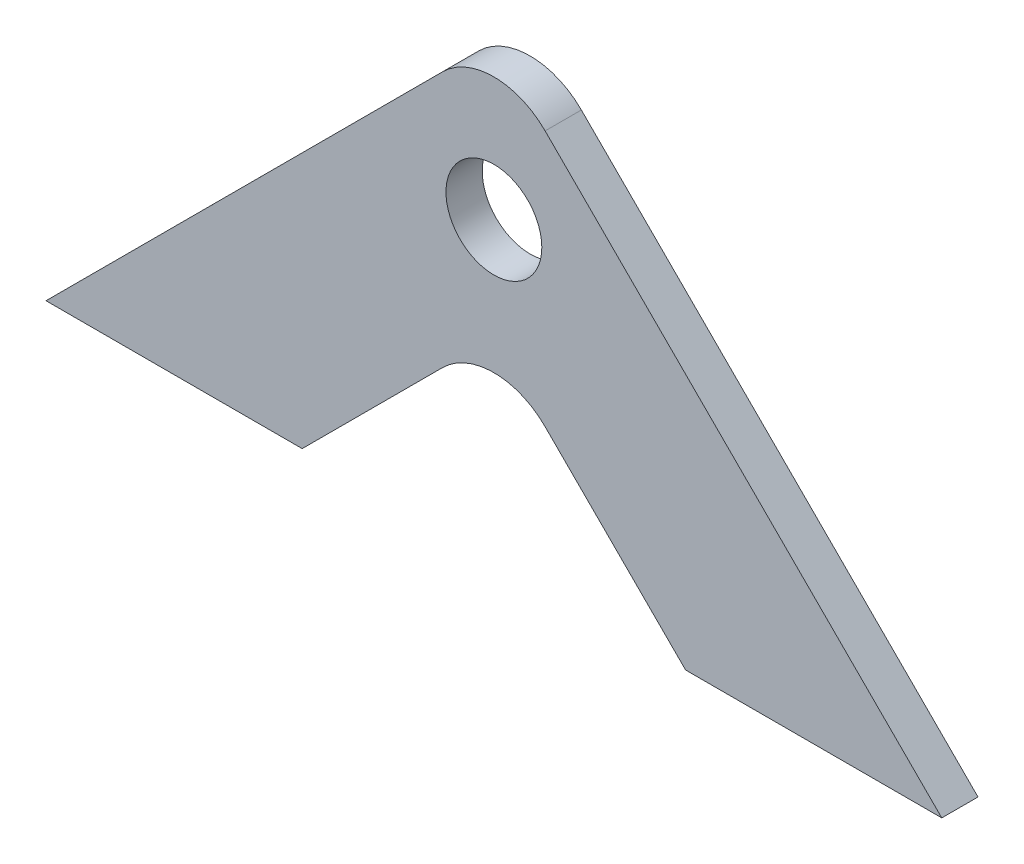
ISO-10303-21;
HEADER;
FILE_DESCRIPTION(('STEP AP214'),'2;1');
FILE_NAME('part.step','',(''),(''),'','','');
FILE_SCHEMA(('AUTOMOTIVE_DESIGN { 1 0 10303 214 1 1 1 1 }'));
ENDSEC;
DATA;
#1=APPLICATION_CONTEXT('core data for automotive mechanical design processes');
#2=APPLICATION_PROTOCOL_DEFINITION('international standard','automotive_design',2000,#1);
#3=PRODUCT_CONTEXT('',#1,'mechanical');
#4=PRODUCT('Part','Part','',(#3));
#5=PRODUCT_RELATED_PRODUCT_CATEGORY('part','',(#4));
#6=PRODUCT_DEFINITION_FORMATION('','',#4);
#7=PRODUCT_DEFINITION_CONTEXT('part definition',#1,'design');
#8=PRODUCT_DEFINITION('design','',#6,#7);
#9=PRODUCT_DEFINITION_SHAPE('','',#8);
#10=(LENGTH_UNIT() NAMED_UNIT(*) SI_UNIT(.MILLI.,.METRE.));
#11=(NAMED_UNIT(*) PLANE_ANGLE_UNIT() SI_UNIT($,.RADIAN.));
#12=(NAMED_UNIT(*) SI_UNIT($,.STERADIAN.) SOLID_ANGLE_UNIT());
#13=UNCERTAINTY_MEASURE_WITH_UNIT(LENGTH_MEASURE(1.E-05),#10,'distance_accuracy_value','');
#14=(GEOMETRIC_REPRESENTATION_CONTEXT(3) GLOBAL_UNCERTAINTY_ASSIGNED_CONTEXT((#13)) GLOBAL_UNIT_ASSIGNED_CONTEXT((#10,
#11,#12)) REPRESENTATION_CONTEXT('',''));
#15=CARTESIAN_POINT('',(0.,0.,0.));
#16=DIRECTION('',(0.,0.,1.));
#17=DIRECTION('',(1.,0.,0.));
#18=AXIS2_PLACEMENT_3D('',#15,#16,#17);
#19=CARTESIAN_POINT('',(44.8343967267449,44.8352566752149,-3.175));
#20=DIRECTION('',(0.707099999869934,0.707113562438128,0.));
#21=DIRECTION('',(-0.707113562438128,0.707099999869934,0.));
#22=AXIS2_PLACEMENT_3D('',#19,#20,#21);
#23=PLANE('',#22);
#24=DIRECTION('',(0.707113562438128,-0.707099999869934,0.));
#25=VECTOR('',#24,1.);
#26=CARTESIAN_POINT('',(44.8343967267449,44.8352566752149,0.));
#27=LINE('',#26,#25);
#28=CARTESIAN_POINT('',(42.5900849991741,47.079525356474,0.));
#29=VERTEX_POINT('',#28);
#30=CARTESIAN_POINT('',(77.3512770817062,12.319,0.));
#31=VERTEX_POINT('',#30);
#32=EDGE_CURVE('E143',#29,#31,#27,.T.);
#33=ORIENTED_EDGE('',*,*,#32,.T.);
#34=DIRECTION('',(0.,0.,1.));
#35=VECTOR('',#34,1.);
#36=CARTESIAN_POINT('',(77.3512770817062,12.319,-3.175));
#37=LINE('',#36,#35);
#38=CARTESIAN_POINT('',(77.3512770817062,12.319,-3.175));
#39=VERTEX_POINT('',#38);
#40=EDGE_CURVE('E160',#39,#31,#37,.T.);
#41=ORIENTED_EDGE('',*,*,#40,.F.);
#42=DIRECTION('',(0.707113562438128,-0.707099999869934,0.));
#43=VECTOR('',#42,1.);
#44=CARTESIAN_POINT('',(44.8343967267449,44.8352566752149,-3.175));
#45=LINE('',#44,#43);
#46=CARTESIAN_POINT('',(42.5900849991741,47.079525356474,-3.175));
#47=VERTEX_POINT('',#46);
#48=EDGE_CURVE('E180',#47,#39,#45,.T.);
#49=ORIENTED_EDGE('',*,*,#48,.F.);
#50=DIRECTION('',(0.,0.,1.));
#51=VECTOR('',#50,1.);
#52=CARTESIAN_POINT('',(42.5900849991741,47.079525356474,-3.175));
#53=LINE('',#52,#51);
#54=EDGE_CURVE('E11',#47,#29,#53,.T.);
#55=ORIENTED_EDGE('',*,*,#54,.T.);
#56=EDGE_LOOP('',(#33,#41,#49,#55));
#57=FACE_BOUND('',#56,.T.);
#58=ADVANCED_FACE('F45',(#57),#23,.T.);
#59=CARTESIAN_POINT('',(38.1,42.5893542349919,-3.175));
#60=DIRECTION('',(0.,0.,1.));
#61=DIRECTION('',(-1.,0.,0.));
#62=AXIS2_PLACEMENT_3D('',#59,#60,#61);
#63=CYLINDRICAL_SURFACE('',#62,6.35);
#64=CARTESIAN_POINT('',(38.1,42.5893542349919,0.));
#65=DIRECTION('',(0.,0.,1.));
#66=DIRECTION('',(1.,0.,0.));
#67=AXIS2_PLACEMENT_3D('',#64,#65,#66);
#68=CIRCLE('',#67,6.35);
#69=CARTESIAN_POINT('',(33.6099150008259,47.079525356474,0.));
#70=VERTEX_POINT('',#69);
#71=EDGE_CURVE('E146',#29,#70,#68,.T.);
#72=ORIENTED_EDGE('',*,*,#71,.F.);
#73=ORIENTED_EDGE('',*,*,#54,.F.);
#74=CARTESIAN_POINT('',(38.1,42.5893542349919,-3.175));
#75=DIRECTION('',(0.,0.,1.));
#76=DIRECTION('',(1.,0.,0.));
#77=AXIS2_PLACEMENT_3D('',#74,#75,#76);
#78=CIRCLE('',#77,6.35);
#79=CARTESIAN_POINT('',(33.6099150008259,47.079525356474,-3.175));
#80=VERTEX_POINT('',#79);
#81=EDGE_CURVE('E100',#47,#80,#78,.T.);
#82=ORIENTED_EDGE('',*,*,#81,.T.);
#83=DIRECTION('',(0.,0.,1.));
#84=VECTOR('',#83,1.);
#85=CARTESIAN_POINT('',(33.6099150008259,47.079525356474,-3.175));
#86=LINE('',#85,#84);
#87=EDGE_CURVE('E54',#80,#70,#86,.T.);
#88=ORIENTED_EDGE('',*,*,#87,.T.);
#89=EDGE_LOOP('',(#72,#73,#82,#88));
#90=FACE_BOUND('',#89,.T.);
#91=ADVANCED_FACE('F172',(#90),#63,.T.);
#92=CARTESIAN_POINT('',(-6.73512749876113,6.73525668222317,-3.175));
#93=DIRECTION('',(-0.707099999869934,0.707113562438127,0.));
#94=DIRECTION('',(-0.707113562438127,-0.707099999869934,0.));
#95=AXIS2_PLACEMENT_3D('',#92,#93,#94);
#96=PLANE('',#95);
#97=DIRECTION('',(0.707113562438127,0.707099999869934,0.));
#98=VECTOR('',#97,1.);
#99=CARTESIAN_POINT('',(-6.73512749876113,6.73525668222317,0.));
#100=LINE('',#99,#98);
#101=CARTESIAN_POINT('',(-1.15127708170621,12.319,0.));
#102=VERTEX_POINT('',#101);
#103=EDGE_CURVE('E149',#102,#70,#100,.T.);
#104=ORIENTED_EDGE('',*,*,#103,.T.);
#105=ORIENTED_EDGE('',*,*,#87,.F.);
#106=DIRECTION('',(0.707113562438127,0.707099999869934,0.));
#107=VECTOR('',#106,1.);
#108=CARTESIAN_POINT('',(-6.73512749876113,6.73525668222317,-3.175));
#109=LINE('',#108,#107);
#110=CARTESIAN_POINT('',(-1.15127708170621,12.319,-3.175));
#111=VERTEX_POINT('',#110);
#112=EDGE_CURVE('E183',#111,#80,#109,.T.);
#113=ORIENTED_EDGE('',*,*,#112,.F.);
#114=DIRECTION('',(0.,0.,1.));
#115=VECTOR('',#114,1.);
#116=CARTESIAN_POINT('',(-1.15127708170621,12.319,-3.175));
#117=LINE('',#116,#115);
#118=EDGE_CURVE('E167',#111,#102,#117,.T.);
#119=ORIENTED_EDGE('',*,*,#118,.T.);
#120=EDGE_LOOP('',(#104,#105,#113,#119));
#121=FACE_BOUND('',#120,.T.);
#122=ADVANCED_FACE('F195',(#121),#96,.T.);
#123=CARTESIAN_POINT('',(0.,12.319,-3.175));
#124=DIRECTION('',(0.,1.,0.));
#125=DIRECTION('',(0.,0.,-1.));
#126=AXIS2_PLACEMENT_3D('',#123,#124,#125);
#127=PLANE('',#126);
#128=DIRECTION('',(1.,0.,0.));
#129=VECTOR('',#128,1.);
#130=CARTESIAN_POINT('',(0.,12.319,0.));
#131=LINE('',#130,#129);
#132=CARTESIAN_POINT('',(21.299578529834,12.319,0.));
#133=VERTEX_POINT('',#132);
#134=EDGE_CURVE('E151',#102,#133,#131,.T.);
#135=ORIENTED_EDGE('',*,*,#134,.F.);
#136=ORIENTED_EDGE('',*,*,#118,.F.);
#137=DIRECTION('',(1.,0.,0.));
#138=VECTOR('',#137,1.);
#139=CARTESIAN_POINT('',(0.,12.319,-3.175));
#140=LINE('',#139,#138);
#141=CARTESIAN_POINT('',(21.299578529834,12.319,-3.175));
#142=VERTEX_POINT('',#141);
#143=EDGE_CURVE('E136',#111,#142,#140,.T.);
#144=ORIENTED_EDGE('',*,*,#143,.T.);
#145=DIRECTION('',(0.,0.,1.));
#146=VECTOR('',#145,1.);
#147=CARTESIAN_POINT('',(21.299578529834,12.319,-3.175));
#148=LINE('',#147,#146);
#149=EDGE_CURVE('E164',#142,#133,#148,.T.);
#150=ORIENTED_EDGE('',*,*,#149,.T.);
#151=EDGE_LOOP('',(#135,#136,#144,#150));
#152=FACE_BOUND('',#151,.T.);
#153=ADVANCED_FACE('F191',(#152),#127,.F.);
#154=CARTESIAN_POINT('',(4.49008499917408,-4.49017112148211,-3.175));
#155=DIRECTION('',(-0.707099999869934,0.707113562438127,0.));
#156=DIRECTION('',(-0.707113562438128,-0.707099999869934,0.));
#157=AXIS2_PLACEMENT_3D('',#154,#155,#156);
#158=PLANE('',#157);
#159=DIRECTION('',(0.707113562438128,0.707099999869934,0.));
#160=VECTOR('',#159,1.);
#161=CARTESIAN_POINT('',(4.49008499917408,-4.49017112148211,0.));
#162=LINE('',#161,#160);
#163=CARTESIAN_POINT('',(33.6099150008259,24.629100356474,0.));
#164=VERTEX_POINT('',#163);
#165=EDGE_CURVE('E154',#133,#164,#162,.T.);
#166=ORIENTED_EDGE('',*,*,#165,.F.);
#167=ORIENTED_EDGE('',*,*,#149,.F.);
#168=DIRECTION('',(0.707113562438128,0.707099999869934,0.));
#169=VECTOR('',#168,1.);
#170=CARTESIAN_POINT('',(4.49008499917408,-4.49017112148211,-3.175));
#171=LINE('',#170,#169);
#172=CARTESIAN_POINT('',(33.6099150008259,24.629100356474,-3.175));
#173=VERTEX_POINT('',#172);
#174=EDGE_CURVE('E134',#142,#173,#171,.T.);
#175=ORIENTED_EDGE('',*,*,#174,.T.);
#176=DIRECTION('',(0.,0.,1.));
#177=VECTOR('',#176,1.);
#178=CARTESIAN_POINT('',(33.6099150008259,24.629100356474,-3.175));
#179=LINE('',#178,#177);
#180=EDGE_CURVE('E128',#173,#164,#179,.T.);
#181=ORIENTED_EDGE('',*,*,#180,.T.);
#182=EDGE_LOOP('',(#166,#167,#175,#181));
#183=FACE_BOUND('',#182,.T.);
#184=ADVANCED_FACE('F194',(#183),#158,.F.);
#185=CARTESIAN_POINT('',(38.1,20.1389292349919,-3.175));
#186=DIRECTION('',(0.,0.,1.));
#187=DIRECTION('',(-1.,0.,0.));
#188=AXIS2_PLACEMENT_3D('',#185,#186,#187);
#189=CYLINDRICAL_SURFACE('',#188,6.35);
#190=CARTESIAN_POINT('',(38.1,20.1389292349919,0.));
#191=DIRECTION('',(0.,0.,1.));
#192=DIRECTION('',(1.,0.,0.));
#193=AXIS2_PLACEMENT_3D('',#190,#191,#192);
#194=CIRCLE('',#193,6.35);
#195=CARTESIAN_POINT('',(42.5900849991741,24.629100356474,0.));
#196=VERTEX_POINT('',#195);
#197=EDGE_CURVE('E157',#164,#196,#194,.F.);
#198=ORIENTED_EDGE('',*,*,#197,.F.);
#199=ORIENTED_EDGE('',*,*,#180,.F.);
#200=CARTESIAN_POINT('',(38.1,20.1389292349919,-3.175));
#201=DIRECTION('',(0.,0.,1.));
#202=DIRECTION('',(1.,0.,0.));
#203=AXIS2_PLACEMENT_3D('',#200,#201,#202);
#204=CIRCLE('',#203,6.35);
#205=CARTESIAN_POINT('',(42.5900849991741,24.629100356474,-3.175));
#206=VERTEX_POINT('',#205);
#207=EDGE_CURVE('E118',#173,#206,#204,.F.);
#208=ORIENTED_EDGE('',*,*,#207,.T.);
#209=DIRECTION('',(0.,0.,1.));
#210=VECTOR('',#209,1.);
#211=CARTESIAN_POINT('',(42.5900849991741,24.629100356474,-3.175));
#212=LINE('',#211,#210);
#213=EDGE_CURVE('E123',#206,#196,#212,.T.);
#214=ORIENTED_EDGE('',*,*,#213,.T.);
#215=EDGE_LOOP('',(#198,#199,#208,#214));
#216=FACE_BOUND('',#215,.T.);
#217=ADVANCED_FACE('F131',(#216),#189,.F.);
#218=CARTESIAN_POINT('',(33.6091842288097,33.6098288715097,-3.175));
#219=DIRECTION('',(0.707099999869934,0.707113562438128,0.));
#220=DIRECTION('',(-0.707113562438128,0.707099999869934,0.));
#221=AXIS2_PLACEMENT_3D('',#218,#219,#220);
#222=PLANE('',#221);
#223=DIRECTION('',(0.707113562438128,-0.707099999869934,0.));
#224=VECTOR('',#223,1.);
#225=CARTESIAN_POINT('',(33.6091842288097,33.6098288715097,0.));
#226=LINE('',#225,#224);
#227=CARTESIAN_POINT('',(54.900421470166,12.319,0.));
#228=VERTEX_POINT('',#227);
#229=EDGE_CURVE('E125',#196,#228,#226,.T.);
#230=ORIENTED_EDGE('',*,*,#229,.F.);
#231=ORIENTED_EDGE('',*,*,#213,.F.);
#232=DIRECTION('',(0.707113562438128,-0.707099999869934,0.));
#233=VECTOR('',#232,1.);
#234=CARTESIAN_POINT('',(33.6091842288097,33.6098288715097,-3.175));
#235=LINE('',#234,#233);
#236=CARTESIAN_POINT('',(54.900421470166,12.319,-3.175));
#237=VERTEX_POINT('',#236);
#238=EDGE_CURVE('E114',#206,#237,#235,.T.);
#239=ORIENTED_EDGE('',*,*,#238,.T.);
#240=DIRECTION('',(0.,0.,1.));
#241=VECTOR('',#240,1.);
#242=CARTESIAN_POINT('',(54.900421470166,12.319,-3.175));
#243=LINE('',#242,#241);
#244=EDGE_CURVE('E129',#237,#228,#243,.T.);
#245=ORIENTED_EDGE('',*,*,#244,.T.);
#246=EDGE_LOOP('',(#230,#231,#239,#245));
#247=FACE_BOUND('',#246,.T.);
#248=ADVANCED_FACE('F124',(#247),#222,.F.);
#249=CARTESIAN_POINT('',(38.1,38.0992692349919,-3.175));
#250=DIRECTION('',(0.,0.,1.));
#251=DIRECTION('',(-1.,0.,0.));
#252=AXIS2_PLACEMENT_3D('',#249,#250,#251);
#253=CYLINDRICAL_SURFACE('',#252,4.19988999999999);
#254=CARTESIAN_POINT('',(38.1,38.0992692349919,-3.175));
#255=DIRECTION('',(0.,0.,1.));
#256=DIRECTION('',(1.,0.,0.));
#257=AXIS2_PLACEMENT_3D('',#254,#255,#256);
#258=CIRCLE('',#257,4.19988999999999);
#259=CARTESIAN_POINT('',(42.29989,38.0992692349919,-3.175));
#260=VERTEX_POINT('',#259);
#261=EDGE_CURVE('E181',#260,#260,#258,.T.);
#262=ORIENTED_EDGE('',*,*,#261,.F.);
#263=EDGE_LOOP('',(#262));
#264=FACE_BOUND('',#263,.T.);
#265=CARTESIAN_POINT('',(38.1,38.0992692349919,0.));
#266=DIRECTION('',(0.,0.,1.));
#267=DIRECTION('',(1.,0.,0.));
#268=AXIS2_PLACEMENT_3D('',#265,#266,#267);
#269=CIRCLE('',#268,4.19988999999999);
#270=CARTESIAN_POINT('',(42.29989,38.0992692349919,0.));
#271=VERTEX_POINT('',#270);
#272=EDGE_CURVE('E140',#271,#271,#269,.T.);
#273=ORIENTED_EDGE('',*,*,#272,.T.);
#274=EDGE_LOOP('',(#273));
#275=FACE_BOUND('',#274,.T.);
#276=ADVANCED_FACE('F47',(#264,#275),#253,.F.);
#277=EDGE_CURVE('E88',#228,#31,#131,.T.);
#278=ORIENTED_EDGE('',*,*,#277,.F.);
#279=ORIENTED_EDGE('',*,*,#244,.F.);
#280=EDGE_CURVE('E62',#237,#39,#140,.T.);
#281=ORIENTED_EDGE('',*,*,#280,.T.);
#282=ORIENTED_EDGE('',*,*,#40,.T.);
#283=EDGE_LOOP('',(#278,#279,#281,#282));
#284=FACE_BOUND('',#283,.T.);
#285=ADVANCED_FACE('F203',(#284),#127,.F.);
#286=CARTESIAN_POINT('',(0.,0.,-3.175));
#287=DIRECTION('',(0.,0.,-1.));
#288=DIRECTION('',(1.,0.,0.));
#289=AXIS2_PLACEMENT_3D('',#286,#287,#288);
#290=PLANE('',#289);
#291=ORIENTED_EDGE('',*,*,#261,.T.);
#292=EDGE_LOOP('',(#291));
#293=FACE_BOUND('',#292,.T.);
#294=ORIENTED_EDGE('',*,*,#48,.T.);
#295=ORIENTED_EDGE('',*,*,#280,.F.);
#296=ORIENTED_EDGE('',*,*,#238,.F.);
#297=ORIENTED_EDGE('',*,*,#207,.F.);
#298=ORIENTED_EDGE('',*,*,#174,.F.);
#299=ORIENTED_EDGE('',*,*,#143,.F.);
#300=ORIENTED_EDGE('',*,*,#112,.T.);
#301=ORIENTED_EDGE('',*,*,#81,.F.);
#302=EDGE_LOOP('',(#294,#295,#296,#297,#298,#299,#300,#301));
#303=FACE_BOUND('',#302,.T.);
#304=ADVANCED_FACE('F116',(#293,#303),#290,.T.);
#305=CARTESIAN_POINT('',(0.,0.,0.));
#306=DIRECTION('',(0.,0.,-1.));
#307=DIRECTION('',(1.,0.,0.));
#308=AXIS2_PLACEMENT_3D('',#305,#306,#307);
#309=PLANE('',#308);
#310=ORIENTED_EDGE('',*,*,#272,.F.);
#311=EDGE_LOOP('',(#310));
#312=FACE_BOUND('',#311,.T.);
#313=ORIENTED_EDGE('',*,*,#32,.F.);
#314=ORIENTED_EDGE('',*,*,#71,.T.);
#315=ORIENTED_EDGE('',*,*,#103,.F.);
#316=ORIENTED_EDGE('',*,*,#134,.T.);
#317=ORIENTED_EDGE('',*,*,#165,.T.);
#318=ORIENTED_EDGE('',*,*,#197,.T.);
#319=ORIENTED_EDGE('',*,*,#229,.T.);
#320=ORIENTED_EDGE('',*,*,#277,.T.);
#321=EDGE_LOOP('',(#313,#314,#315,#316,#317,#318,#319,#320));
#322=FACE_BOUND('',#321,.T.);
#323=ADVANCED_FACE('F176',(#312,#322),#309,.F.);
#324=CLOSED_SHELL('',(#58,#91,#122,#153,#184,#217,#248,#276,#285,#304,#323));
#325=MANIFOLD_SOLID_BREP('B2',#324);
#326=ADVANCED_BREP_SHAPE_REPRESENTATION('',(#18,#325),#14);
#327=SHAPE_DEFINITION_REPRESENTATION(#9,#326);
ENDSEC;
END-ISO-10303-21;
